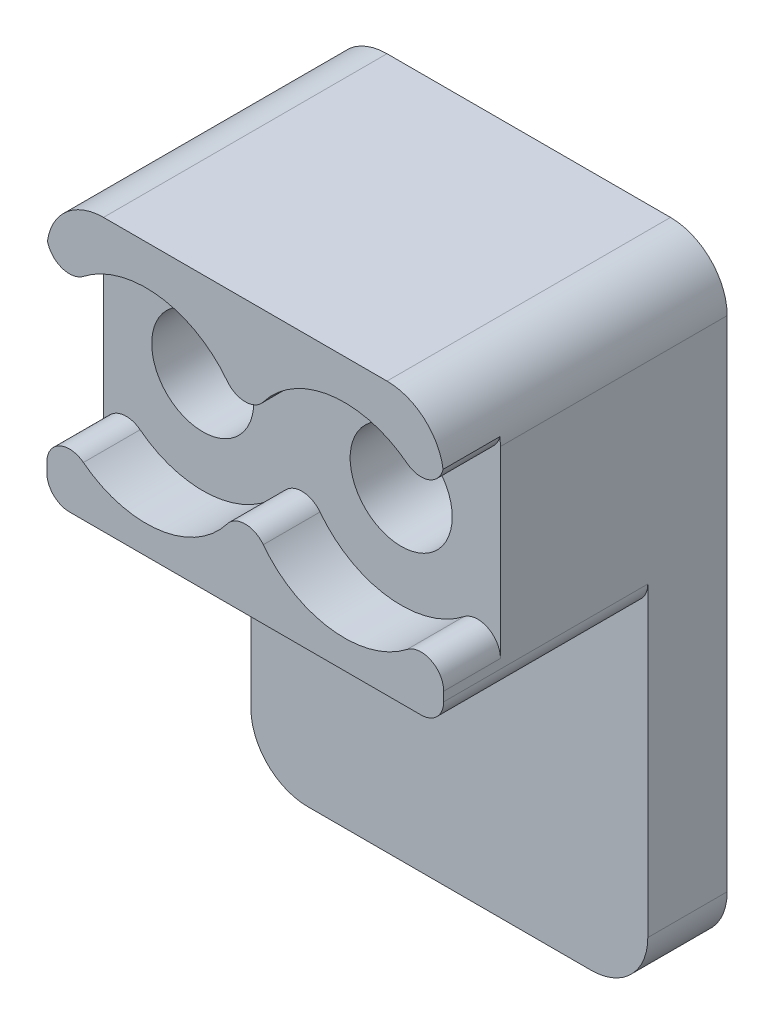
ISO-10303-21;
HEADER;
FILE_DESCRIPTION(('STEP AP214'),'2;1');
FILE_NAME('part.step','',(''),(''),'','','');
FILE_SCHEMA(('AUTOMOTIVE_DESIGN { 1 0 10303 214 1 1 1 1 }'));
ENDSEC;
DATA;
#1=APPLICATION_CONTEXT('core data for automotive mechanical design processes');
#2=APPLICATION_PROTOCOL_DEFINITION('international standard','automotive_design',2000,#1);
#3=PRODUCT_CONTEXT('',#1,'mechanical');
#4=PRODUCT('Part','Part','',(#3));
#5=PRODUCT_RELATED_PRODUCT_CATEGORY('part','',(#4));
#6=PRODUCT_DEFINITION_FORMATION('','',#4);
#7=PRODUCT_DEFINITION_CONTEXT('part definition',#1,'design');
#8=PRODUCT_DEFINITION('design','',#6,#7);
#9=PRODUCT_DEFINITION_SHAPE('','',#8);
#10=(LENGTH_UNIT() NAMED_UNIT(*) SI_UNIT(.MILLI.,.METRE.));
#11=(NAMED_UNIT(*) PLANE_ANGLE_UNIT() SI_UNIT($,.RADIAN.));
#12=(NAMED_UNIT(*) SI_UNIT($,.STERADIAN.) SOLID_ANGLE_UNIT());
#13=UNCERTAINTY_MEASURE_WITH_UNIT(LENGTH_MEASURE(1.E-05),#10,'distance_accuracy_value','');
#14=(GEOMETRIC_REPRESENTATION_CONTEXT(3) GLOBAL_UNCERTAINTY_ASSIGNED_CONTEXT((#13)) GLOBAL_UNIT_ASSIGNED_CONTEXT((#10,
#11,#12)) REPRESENTATION_CONTEXT('',''));
#15=CARTESIAN_POINT('',(0.,0.,0.));
#16=DIRECTION('',(0.,0.,1.));
#17=DIRECTION('',(1.,0.,0.));
#18=AXIS2_PLACEMENT_3D('',#15,#16,#17);
#19=CARTESIAN_POINT('',(17.78,27.432,12.7));
#20=DIRECTION('',(0.,0.,-1.));
#21=DIRECTION('',(0.,1.,0.));
#22=AXIS2_PLACEMENT_3D('',#19,#20,#21);
#23=PLANE('',#22);
#24=DIRECTION('',(-1.,0.,0.));
#25=VECTOR('',#24,1.);
#26=CARTESIAN_POINT('',(17.78,27.432,12.7));
#27=LINE('',#26,#25);
#28=CARTESIAN_POINT('',(15.24,27.432,12.7));
#29=VERTEX_POINT('',#28);
#30=CARTESIAN_POINT('',(2.54,27.432,12.7));
#31=VERTEX_POINT('',#30);
#32=EDGE_CURVE('E283',#29,#31,#27,.T.);
#33=ORIENTED_EDGE('',*,*,#32,.T.);
#34=CARTESIAN_POINT('',(2.54,24.892,12.7));
#35=DIRECTION('',(0.,0.,-1.));
#36=DIRECTION('',(0.,1.,0.));
#37=AXIS2_PLACEMENT_3D('',#34,#35,#36);
#38=CIRCLE('',#37,2.54);
#39=CARTESIAN_POINT('',(0.0270169226670651,25.2614807884563,12.7));
#40=VERTEX_POINT('',#39);
#41=EDGE_CURVE('E398',#31,#40,#38,.F.);
#42=ORIENTED_EDGE('',*,*,#41,.T.);
#43=CARTESIAN_POINT('',(1.016,25.4942220025742,12.7));
#44=DIRECTION('',(0.,0.,-1.));
#45=DIRECTION('',(0.,1.,0.));
#46=AXIS2_PLACEMENT_3D('',#43,#44,#45);
#47=CIRCLE('',#46,1.016);
#48=CARTESIAN_POINT('',(1.63945454545455,24.691999820288,12.7));
#49=VERTEX_POINT('',#48);
#50=EDGE_CURVE('E326',#40,#49,#47,.F.);
#51=ORIENTED_EDGE('',*,*,#50,.T.);
#52=CARTESIAN_POINT('',(4.445,21.082,12.7));
#53=DIRECTION('',(0.,0.,1.));
#54=DIRECTION('',(1.,0.,0.));
#55=AXIS2_PLACEMENT_3D('',#52,#53,#54);
#56=CIRCLE('',#55,4.572);
#57=CARTESIAN_POINT('',(8.08181818181818,23.8526926051796,12.7));
#58=VERTEX_POINT('',#57);
#59=EDGE_CURVE('E239',#58,#49,#56,.T.);
#60=ORIENTED_EDGE('',*,*,#59,.F.);
#61=CARTESIAN_POINT('',(8.89,24.4684020729972,12.7));
#62=DIRECTION('',(0.,0.,-1.));
#63=DIRECTION('',(0.,1.,0.));
#64=AXIS2_PLACEMENT_3D('',#61,#62,#63);
#65=CIRCLE('',#64,1.016);
#66=CARTESIAN_POINT('',(9.69818181818182,23.8526926051796,12.7));
#67=VERTEX_POINT('',#66);
#68=EDGE_CURVE('E329',#58,#67,#65,.F.);
#69=ORIENTED_EDGE('',*,*,#68,.T.);
#70=CARTESIAN_POINT('',(13.335,21.082,12.7));
#71=DIRECTION('',(0.,0.,1.));
#72=DIRECTION('',(1.,0.,0.));
#73=AXIS2_PLACEMENT_3D('',#70,#71,#72);
#74=CIRCLE('',#73,4.572);
#75=CARTESIAN_POINT('',(16.1405454545455,24.691999820288,12.7));
#76=VERTEX_POINT('',#75);
#77=EDGE_CURVE('E233',#76,#67,#74,.T.);
#78=ORIENTED_EDGE('',*,*,#77,.F.);
#79=CARTESIAN_POINT('',(16.764,25.4942220025742,12.7));
#80=DIRECTION('',(0.,0.,-1.));
#81=DIRECTION('',(0.,1.,0.));
#82=AXIS2_PLACEMENT_3D('',#79,#80,#81);
#83=CIRCLE('',#82,1.016);
#84=CARTESIAN_POINT('',(17.7529830773329,25.2614807884563,12.7));
#85=VERTEX_POINT('',#84);
#86=EDGE_CURVE('E322',#76,#85,#83,.F.);
#87=ORIENTED_EDGE('',*,*,#86,.T.);
#88=CARTESIAN_POINT('',(15.24,24.892,12.7));
#89=DIRECTION('',(0.,0.,-1.));
#90=DIRECTION('',(0.,1.,0.));
#91=AXIS2_PLACEMENT_3D('',#88,#89,#90);
#92=CIRCLE('',#91,2.54);
#93=EDGE_CURVE('E395',#85,#29,#92,.F.);
#94=ORIENTED_EDGE('',*,*,#93,.T.);
#95=EDGE_LOOP('',(#33,#42,#51,#60,#69,#78,#87,#94));
#96=FACE_BOUND('',#95,.T.);
#97=ADVANCED_FACE('F42',(#96),#23,.F.);
#98=CARTESIAN_POINT('',(13.335,21.082,0.));
#99=DIRECTION('',(0.,0.,1.));
#100=DIRECTION('',(1.,0.,0.));
#101=AXIS2_PLACEMENT_3D('',#98,#99,#100);
#102=CYLINDRICAL_SURFACE('',#101,2.286);
#103=CARTESIAN_POINT('',(13.335,21.082,0.));
#104=DIRECTION('',(0.,0.,1.));
#105=DIRECTION('',(-1.,0.,0.));
#106=AXIS2_PLACEMENT_3D('',#103,#104,#105);
#107=CIRCLE('',#106,2.286);
#108=CARTESIAN_POINT('',(11.049,21.082,0.));
#109=VERTEX_POINT('',#108);
#110=EDGE_CURVE('E248',#109,#109,#107,.T.);
#111=ORIENTED_EDGE('',*,*,#110,.F.);
#112=EDGE_LOOP('',(#111));
#113=FACE_BOUND('',#112,.T.);
#114=CARTESIAN_POINT('',(13.335,21.082,10.16));
#115=DIRECTION('',(0.,0.,1.));
#116=DIRECTION('',(1.,0.,0.));
#117=AXIS2_PLACEMENT_3D('',#114,#115,#116);
#118=CIRCLE('',#117,2.286);
#119=CARTESIAN_POINT('',(15.621,21.082,10.16));
#120=VERTEX_POINT('',#119);
#121=EDGE_CURVE('E252',#120,#120,#118,.F.);
#122=ORIENTED_EDGE('',*,*,#121,.F.);
#123=EDGE_LOOP('',(#122));
#124=FACE_BOUND('',#123,.T.);
#125=ADVANCED_FACE('F513',(#113,#124),#102,.F.);
#126=CARTESIAN_POINT('',(4.445,21.082,0.));
#127=DIRECTION('',(0.,0.,1.));
#128=DIRECTION('',(1.,0.,0.));
#129=AXIS2_PLACEMENT_3D('',#126,#127,#128);
#130=CYLINDRICAL_SURFACE('',#129,2.286);
#131=CARTESIAN_POINT('',(4.445,21.082,0.));
#132=DIRECTION('',(0.,0.,1.));
#133=DIRECTION('',(1.,0.,0.));
#134=AXIS2_PLACEMENT_3D('',#131,#132,#133);
#135=CIRCLE('',#134,2.286);
#136=CARTESIAN_POINT('',(6.731,21.082,0.));
#137=VERTEX_POINT('',#136);
#138=EDGE_CURVE('E243',#137,#137,#135,.T.);
#139=ORIENTED_EDGE('',*,*,#138,.F.);
#140=EDGE_LOOP('',(#139));
#141=FACE_BOUND('',#140,.T.);
#142=CARTESIAN_POINT('',(4.445,21.082,10.16));
#143=DIRECTION('',(0.,0.,1.));
#144=DIRECTION('',(1.,0.,0.));
#145=AXIS2_PLACEMENT_3D('',#142,#143,#144);
#146=CIRCLE('',#145,2.286);
#147=CARTESIAN_POINT('',(6.731,21.082,10.16));
#148=VERTEX_POINT('',#147);
#149=EDGE_CURVE('E505',#148,#148,#146,.F.);
#150=ORIENTED_EDGE('',*,*,#149,.F.);
#151=EDGE_LOOP('',(#150));
#152=FACE_BOUND('',#151,.T.);
#153=ADVANCED_FACE('F515',(#141,#152),#130,.F.);
#154=CARTESIAN_POINT('',(17.78,15.24,3.556));
#155=DIRECTION('',(0.,0.,-1.));
#156=DIRECTION('',(0.,1.,0.));
#157=AXIS2_PLACEMENT_3D('',#154,#155,#156);
#158=PLANE('',#157);
#159=DIRECTION('',(0.,-1.,0.));
#160=VECTOR('',#159,1.);
#161=CARTESIAN_POINT('',(0.,15.24,3.556));
#162=LINE('',#161,#160);
#163=CARTESIAN_POINT('',(0.,16.256,3.556));
#164=VERTEX_POINT('',#163);
#165=CARTESIAN_POINT('',(0.,2.54,3.556));
#166=VERTEX_POINT('',#165);
#167=EDGE_CURVE('E247',#164,#166,#162,.T.);
#168=ORIENTED_EDGE('',*,*,#167,.T.);
#169=CARTESIAN_POINT('',(2.54,2.54,3.556));
#170=DIRECTION('',(0.,0.,-1.));
#171=DIRECTION('',(0.,1.,0.));
#172=AXIS2_PLACEMENT_3D('',#169,#170,#171);
#173=CIRCLE('',#172,2.54);
#174=CARTESIAN_POINT('',(2.54,0.,3.556));
#175=VERTEX_POINT('',#174);
#176=EDGE_CURVE('E11',#166,#175,#173,.F.);
#177=ORIENTED_EDGE('',*,*,#176,.T.);
#178=DIRECTION('',(-1.,0.,0.));
#179=VECTOR('',#178,1.);
#180=CARTESIAN_POINT('',(17.78,0.,3.556));
#181=LINE('',#180,#179);
#182=CARTESIAN_POINT('',(15.24,0.,3.556));
#183=VERTEX_POINT('',#182);
#184=EDGE_CURVE('E295',#183,#175,#181,.T.);
#185=ORIENTED_EDGE('',*,*,#184,.F.);
#186=CARTESIAN_POINT('',(15.24,2.54,3.556));
#187=DIRECTION('',(0.,0.,-1.));
#188=DIRECTION('',(0.,1.,0.));
#189=AXIS2_PLACEMENT_3D('',#186,#187,#188);
#190=CIRCLE('',#189,2.54);
#191=CARTESIAN_POINT('',(17.78,2.54,3.556));
#192=VERTEX_POINT('',#191);
#193=EDGE_CURVE('E51',#183,#192,#190,.F.);
#194=ORIENTED_EDGE('',*,*,#193,.T.);
#195=DIRECTION('',(0.,-1.,0.));
#196=VECTOR('',#195,1.);
#197=CARTESIAN_POINT('',(17.78,15.24,3.556));
#198=LINE('',#197,#196);
#199=CARTESIAN_POINT('',(17.78,16.256,3.556));
#200=VERTEX_POINT('',#199);
#201=EDGE_CURVE('E253',#200,#192,#198,.T.);
#202=ORIENTED_EDGE('',*,*,#201,.F.);
#203=CARTESIAN_POINT('',(16.764,16.256,3.556));
#204=DIRECTION('',(0.,0.,-1.));
#205=DIRECTION('',(0.,1.,0.));
#206=AXIS2_PLACEMENT_3D('',#203,#204,#205);
#207=CIRCLE('',#206,1.016);
#208=CARTESIAN_POINT('',(16.764,15.24,3.556));
#209=VERTEX_POINT('',#208);
#210=EDGE_CURVE('E367',#200,#209,#207,.T.);
#211=ORIENTED_EDGE('',*,*,#210,.T.);
#212=DIRECTION('',(-1.,0.,0.));
#213=VECTOR('',#212,1.);
#214=CARTESIAN_POINT('',(17.78,15.24,3.556));
#215=LINE('',#214,#213);
#216=CARTESIAN_POINT('',(1.016,15.24,3.556));
#217=VERTEX_POINT('',#216);
#218=EDGE_CURVE('E266',#209,#217,#215,.T.);
#219=ORIENTED_EDGE('',*,*,#218,.T.);
#220=CARTESIAN_POINT('',(1.016,16.256,3.556));
#221=DIRECTION('',(0.,0.,-1.));
#222=DIRECTION('',(0.,1.,0.));
#223=AXIS2_PLACEMENT_3D('',#220,#221,#222);
#224=CIRCLE('',#223,1.016);
#225=EDGE_CURVE('E370',#217,#164,#224,.T.);
#226=ORIENTED_EDGE('',*,*,#225,.T.);
#227=EDGE_LOOP('',(#168,#177,#185,#194,#202,#211,#219,#226));
#228=FACE_BOUND('',#227,.T.);
#229=ADVANCED_FACE('F446',(#228),#158,.F.);
#230=CARTESIAN_POINT('',(17.78,0.,3.556));
#231=DIRECTION('',(0.,1.,0.));
#232=DIRECTION('',(0.,0.,1.));
#233=AXIS2_PLACEMENT_3D('',#230,#231,#232);
#234=PLANE('',#233);
#235=ORIENTED_EDGE('',*,*,#184,.T.);
#236=DIRECTION('',(0.,0.,-1.));
#237=VECTOR('',#236,1.);
#238=CARTESIAN_POINT('',(2.54,0.,3.556));
#239=LINE('',#238,#237);
#240=CARTESIAN_POINT('',(2.54,0.,0.));
#241=VERTEX_POINT('',#240);
#242=EDGE_CURVE('E441',#175,#241,#239,.T.);
#243=ORIENTED_EDGE('',*,*,#242,.T.);
#244=DIRECTION('',(-1.,0.,0.));
#245=VECTOR('',#244,1.);
#246=CARTESIAN_POINT('',(17.78,0.,0.));
#247=LINE('',#246,#245);
#248=CARTESIAN_POINT('',(15.24,0.,0.));
#249=VERTEX_POINT('',#248);
#250=EDGE_CURVE('E291',#249,#241,#247,.T.);
#251=ORIENTED_EDGE('',*,*,#250,.F.);
#252=DIRECTION('',(0.,0.,-1.));
#253=VECTOR('',#252,1.);
#254=CARTESIAN_POINT('',(15.24,0.,3.556));
#255=LINE('',#254,#253);
#256=EDGE_CURVE('E63',#249,#183,#255,.F.);
#257=ORIENTED_EDGE('',*,*,#256,.T.);
#258=EDGE_LOOP('',(#235,#243,#251,#257));
#259=FACE_BOUND('',#258,.T.);
#260=ADVANCED_FACE('F456',(#259),#234,.F.);
#261=CARTESIAN_POINT('',(17.78,0.,0.));
#262=DIRECTION('',(0.,0.,1.));
#263=DIRECTION('',(1.,0.,0.));
#264=AXIS2_PLACEMENT_3D('',#261,#262,#263);
#265=PLANE('',#264);
#266=ORIENTED_EDGE('',*,*,#138,.T.);
#267=EDGE_LOOP('',(#266));
#268=FACE_BOUND('',#267,.T.);
#269=ORIENTED_EDGE('',*,*,#110,.T.);
#270=EDGE_LOOP('',(#269));
#271=FACE_BOUND('',#270,.T.);
#272=DIRECTION('',(0.,1.,0.));
#273=VECTOR('',#272,1.);
#274=CARTESIAN_POINT('',(0.,0.,0.));
#275=LINE('',#274,#273);
#276=CARTESIAN_POINT('',(0.,2.54,0.));
#277=VERTEX_POINT('',#276);
#278=CARTESIAN_POINT('',(0.,24.892,0.));
#279=VERTEX_POINT('',#278);
#280=EDGE_CURVE('E269',#277,#279,#275,.T.);
#281=ORIENTED_EDGE('',*,*,#280,.T.);
#282=CARTESIAN_POINT('',(2.54,24.892,0.));
#283=DIRECTION('',(0.,0.,1.));
#284=DIRECTION('',(1.,0.,0.));
#285=AXIS2_PLACEMENT_3D('',#282,#283,#284);
#286=CIRCLE('',#285,2.54);
#287=CARTESIAN_POINT('',(2.54,27.432,0.));
#288=VERTEX_POINT('',#287);
#289=EDGE_CURVE('E425',#279,#288,#286,.F.);
#290=ORIENTED_EDGE('',*,*,#289,.T.);
#291=DIRECTION('',(-1.,0.,0.));
#292=VECTOR('',#291,1.);
#293=CARTESIAN_POINT('',(17.78,27.432,0.));
#294=LINE('',#293,#292);
#295=CARTESIAN_POINT('',(15.24,27.432,0.));
#296=VERTEX_POINT('',#295);
#297=EDGE_CURVE('E287',#296,#288,#294,.T.);
#298=ORIENTED_EDGE('',*,*,#297,.F.);
#299=CARTESIAN_POINT('',(15.24,24.892,0.));
#300=DIRECTION('',(0.,0.,1.));
#301=DIRECTION('',(1.,0.,0.));
#302=AXIS2_PLACEMENT_3D('',#299,#300,#301);
#303=CIRCLE('',#302,2.54);
#304=CARTESIAN_POINT('',(17.78,24.892,0.));
#305=VERTEX_POINT('',#304);
#306=EDGE_CURVE('E422',#296,#305,#303,.F.);
#307=ORIENTED_EDGE('',*,*,#306,.T.);
#308=DIRECTION('',(0.,1.,0.));
#309=VECTOR('',#308,1.);
#310=CARTESIAN_POINT('',(17.78,0.,0.));
#311=LINE('',#310,#309);
#312=CARTESIAN_POINT('',(17.78,2.54,0.));
#313=VERTEX_POINT('',#312);
#314=EDGE_CURVE('E257',#313,#305,#311,.T.);
#315=ORIENTED_EDGE('',*,*,#314,.F.);
#316=CARTESIAN_POINT('',(15.24,2.54,0.));
#317=DIRECTION('',(0.,0.,1.));
#318=DIRECTION('',(1.,0.,0.));
#319=AXIS2_PLACEMENT_3D('',#316,#317,#318);
#320=CIRCLE('',#319,2.54);
#321=EDGE_CURVE('E416',#313,#249,#320,.F.);
#322=ORIENTED_EDGE('',*,*,#321,.T.);
#323=ORIENTED_EDGE('',*,*,#250,.T.);
#324=CARTESIAN_POINT('',(2.54,2.54,0.));
#325=DIRECTION('',(0.,0.,1.));
#326=DIRECTION('',(1.,0.,0.));
#327=AXIS2_PLACEMENT_3D('',#324,#325,#326);
#328=CIRCLE('',#327,2.54);
#329=EDGE_CURVE('E419',#241,#277,#328,.F.);
#330=ORIENTED_EDGE('',*,*,#329,.T.);
#331=EDGE_LOOP('',(#281,#290,#298,#307,#315,#322,#323,#330));
#332=FACE_BOUND('',#331,.T.);
#333=ADVANCED_FACE('F455',(#268,#271,#332),#265,.F.);
#334=CARTESIAN_POINT('',(17.78,27.432,0.));
#335=DIRECTION('',(0.,-1.,0.));
#336=DIRECTION('',(0.,0.,-1.));
#337=AXIS2_PLACEMENT_3D('',#334,#335,#336);
#338=PLANE('',#337);
#339=ORIENTED_EDGE('',*,*,#297,.T.);
#340=DIRECTION('',(0.,0.,1.));
#341=VECTOR('',#340,1.);
#342=CARTESIAN_POINT('',(2.54,27.432,0.));
#343=LINE('',#342,#341);
#344=EDGE_CURVE('E391',#288,#31,#343,.T.);
#345=ORIENTED_EDGE('',*,*,#344,.T.);
#346=ORIENTED_EDGE('',*,*,#32,.F.);
#347=DIRECTION('',(0.,0.,1.));
#348=VECTOR('',#347,1.);
#349=CARTESIAN_POINT('',(15.24,27.432,0.));
#350=LINE('',#349,#348);
#351=EDGE_CURVE('E388',#29,#296,#350,.F.);
#352=ORIENTED_EDGE('',*,*,#351,.T.);
#353=EDGE_LOOP('',(#339,#345,#346,#352));
#354=FACE_BOUND('',#353,.T.);
#355=ADVANCED_FACE('F476',(#354),#338,.F.);
#356=CARTESIAN_POINT('',(9.69818181818182,18.3113073948204,12.7));
#357=VERTEX_POINT('',#356);
#358=CARTESIAN_POINT('',(16.1405454545455,17.472000179712,12.7));
#359=VERTEX_POINT('',#358);
#360=EDGE_CURVE('E222',#357,#359,#74,.T.);
#361=ORIENTED_EDGE('',*,*,#360,.F.);
#362=CARTESIAN_POINT('',(8.89,17.6955979270028,12.7));
#363=DIRECTION('',(0.,0.,-1.));
#364=DIRECTION('',(0.,1.,0.));
#365=AXIS2_PLACEMENT_3D('',#362,#363,#364);
#366=CIRCLE('',#365,1.016);
#367=CARTESIAN_POINT('',(8.08181818181818,18.3113073948204,12.7));
#368=VERTEX_POINT('',#367);
#369=EDGE_CURVE('E204',#357,#368,#366,.F.);
#370=ORIENTED_EDGE('',*,*,#369,.T.);
#371=CARTESIAN_POINT('',(1.63945454545455,17.472000179712,12.7));
#372=VERTEX_POINT('',#371);
#373=EDGE_CURVE('E234',#372,#368,#56,.T.);
#374=ORIENTED_EDGE('',*,*,#373,.F.);
#375=CARTESIAN_POINT('',(1.016,16.6697779974258,12.7));
#376=DIRECTION('',(0.,0.,-1.));
#377=DIRECTION('',(0.,1.,0.));
#378=AXIS2_PLACEMENT_3D('',#375,#376,#377);
#379=CIRCLE('',#378,1.016);
#380=CARTESIAN_POINT('',(0.,16.6697779974258,12.7));
#381=VERTEX_POINT('',#380);
#382=EDGE_CURVE('E302',#372,#381,#379,.F.);
#383=ORIENTED_EDGE('',*,*,#382,.T.);
#384=DIRECTION('',(0.,-1.,0.));
#385=VECTOR('',#384,1.);
#386=CARTESIAN_POINT('',(0.,27.432,12.7));
#387=LINE('',#386,#385);
#388=CARTESIAN_POINT('',(0.,16.256,12.7));
#389=VERTEX_POINT('',#388);
#390=EDGE_CURVE('E258',#381,#389,#387,.T.);
#391=ORIENTED_EDGE('',*,*,#390,.T.);
#392=CARTESIAN_POINT('',(1.016,16.256,12.7));
#393=DIRECTION('',(0.,0.,-1.));
#394=DIRECTION('',(0.,1.,0.));
#395=AXIS2_PLACEMENT_3D('',#392,#393,#394);
#396=CIRCLE('',#395,1.016);
#397=CARTESIAN_POINT('',(1.016,15.24,12.7));
#398=VERTEX_POINT('',#397);
#399=EDGE_CURVE('E305',#389,#398,#396,.F.);
#400=ORIENTED_EDGE('',*,*,#399,.T.);
#401=DIRECTION('',(-1.,0.,0.));
#402=VECTOR('',#401,1.);
#403=CARTESIAN_POINT('',(17.78,15.24,12.7));
#404=LINE('',#403,#402);
#405=CARTESIAN_POINT('',(16.764,15.24,12.7));
#406=VERTEX_POINT('',#405);
#407=EDGE_CURVE('E279',#406,#398,#404,.T.);
#408=ORIENTED_EDGE('',*,*,#407,.F.);
#409=CARTESIAN_POINT('',(16.764,16.256,12.7));
#410=DIRECTION('',(0.,0.,-1.));
#411=DIRECTION('',(0.,1.,0.));
#412=AXIS2_PLACEMENT_3D('',#409,#410,#411);
#413=CIRCLE('',#412,1.016);
#414=CARTESIAN_POINT('',(17.78,16.256,12.7));
#415=VERTEX_POINT('',#414);
#416=EDGE_CURVE('E216',#406,#415,#413,.F.);
#417=ORIENTED_EDGE('',*,*,#416,.T.);
#418=DIRECTION('',(0.,-1.,0.));
#419=VECTOR('',#418,1.);
#420=CARTESIAN_POINT('',(17.78,27.432,12.7));
#421=LINE('',#420,#419);
#422=CARTESIAN_POINT('',(17.78,16.6697779974258,12.7));
#423=VERTEX_POINT('',#422);
#424=EDGE_CURVE('E262',#423,#415,#421,.T.);
#425=ORIENTED_EDGE('',*,*,#424,.F.);
#426=CARTESIAN_POINT('',(16.764,16.6697779974258,12.7));
#427=DIRECTION('',(0.,0.,-1.));
#428=DIRECTION('',(0.,1.,0.));
#429=AXIS2_PLACEMENT_3D('',#426,#427,#428);
#430=CIRCLE('',#429,1.016);
#431=EDGE_CURVE('E227',#423,#359,#430,.F.);
#432=ORIENTED_EDGE('',*,*,#431,.T.);
#433=EDGE_LOOP('',(#361,#370,#374,#383,#391,#400,#408,#417,#425,#432));
#434=FACE_BOUND('',#433,.T.);
#435=ADVANCED_FACE('F230',(#434),#23,.F.);
#436=CARTESIAN_POINT('',(17.78,15.24,12.7));
#437=DIRECTION('',(0.,1.,0.));
#438=DIRECTION('',(0.,0.,1.));
#439=AXIS2_PLACEMENT_3D('',#436,#437,#438);
#440=PLANE('',#439);
#441=ORIENTED_EDGE('',*,*,#218,.F.);
#442=DIRECTION('',(0.,0.,-1.));
#443=VECTOR('',#442,1.);
#444=CARTESIAN_POINT('',(16.764,15.24,12.7));
#445=LINE('',#444,#443);
#446=EDGE_CURVE('E351',#209,#406,#445,.F.);
#447=ORIENTED_EDGE('',*,*,#446,.T.);
#448=ORIENTED_EDGE('',*,*,#407,.T.);
#449=DIRECTION('',(0.,0.,-1.));
#450=VECTOR('',#449,1.);
#451=CARTESIAN_POINT('',(1.016,15.24,12.7));
#452=LINE('',#451,#450);
#453=EDGE_CURVE('E347',#398,#217,#452,.T.);
#454=ORIENTED_EDGE('',*,*,#453,.T.);
#455=EDGE_LOOP('',(#441,#447,#448,#454));
#456=FACE_BOUND('',#455,.T.);
#457=ADVANCED_FACE('F531',(#456),#440,.F.);
#458=CARTESIAN_POINT('',(17.78,0.,0.));
#459=DIRECTION('',(1.,0.,0.));
#460=DIRECTION('',(0.,0.,-1.));
#461=AXIS2_PLACEMENT_3D('',#458,#459,#460);
#462=PLANE('',#461);
#463=ORIENTED_EDGE('',*,*,#314,.T.);
#464=DIRECTION('',(0.,0.,1.));
#465=VECTOR('',#464,1.);
#466=CARTESIAN_POINT('',(17.78,24.892,12.7));
#467=LINE('',#466,#465);
#468=CARTESIAN_POINT('',(17.78,24.892,10.16));
#469=VERTEX_POINT('',#468);
#470=EDGE_CURVE('E432',#305,#469,#467,.T.);
#471=ORIENTED_EDGE('',*,*,#470,.T.);
#472=DIRECTION('',(0.,1.,0.));
#473=VECTOR('',#472,1.);
#474=CARTESIAN_POINT('',(17.78,0.,10.16));
#475=LINE('',#474,#473);
#476=CARTESIAN_POINT('',(17.78,16.6697779974258,10.16));
#477=VERTEX_POINT('',#476);
#478=EDGE_CURVE('E485',#477,#469,#475,.T.);
#479=ORIENTED_EDGE('',*,*,#478,.F.);
#480=DIRECTION('',(0.,0.,-1.));
#481=VECTOR('',#480,1.);
#482=CARTESIAN_POINT('',(17.78,16.6697779974258,12.7));
#483=LINE('',#482,#481);
#484=EDGE_CURVE('E339',#477,#423,#483,.F.);
#485=ORIENTED_EDGE('',*,*,#484,.T.);
#486=ORIENTED_EDGE('',*,*,#424,.T.);
#487=DIRECTION('',(0.,0.,-1.));
#488=VECTOR('',#487,1.);
#489=CARTESIAN_POINT('',(17.78,16.256,3.556));
#490=LINE('',#489,#488);
#491=EDGE_CURVE('E343',#415,#200,#490,.T.);
#492=ORIENTED_EDGE('',*,*,#491,.T.);
#493=ORIENTED_EDGE('',*,*,#201,.T.);
#494=DIRECTION('',(0.,0.,-1.));
#495=VECTOR('',#494,1.);
#496=CARTESIAN_POINT('',(17.78,2.54,0.));
#497=LINE('',#496,#495);
#498=EDGE_CURVE('E428',#192,#313,#497,.T.);
#499=ORIENTED_EDGE('',*,*,#498,.T.);
#500=EDGE_LOOP('',(#463,#471,#479,#485,#486,#492,#493,#499));
#501=FACE_BOUND('',#500,.T.);
#502=ADVANCED_FACE('F451',(#501),#462,.T.);
#503=CARTESIAN_POINT('',(0.,0.,0.));
#504=DIRECTION('',(1.,0.,0.));
#505=DIRECTION('',(0.,0.,-1.));
#506=AXIS2_PLACEMENT_3D('',#503,#504,#505);
#507=PLANE('',#506);
#508=DIRECTION('',(0.,-1.,0.));
#509=VECTOR('',#508,1.);
#510=CARTESIAN_POINT('',(0.,0.,10.16));
#511=LINE('',#510,#509);
#512=CARTESIAN_POINT('',(0.,24.892,10.16));
#513=VERTEX_POINT('',#512);
#514=CARTESIAN_POINT('',(0.,16.6697779974258,10.16));
#515=VERTEX_POINT('',#514);
#516=EDGE_CURVE('E467',#513,#515,#511,.T.);
#517=ORIENTED_EDGE('',*,*,#516,.F.);
#518=DIRECTION('',(0.,0.,1.));
#519=VECTOR('',#518,1.);
#520=CARTESIAN_POINT('',(0.,24.892,0.));
#521=LINE('',#520,#519);
#522=EDGE_CURVE('E413',#513,#279,#521,.F.);
#523=ORIENTED_EDGE('',*,*,#522,.T.);
#524=ORIENTED_EDGE('',*,*,#280,.F.);
#525=DIRECTION('',(0.,0.,-1.));
#526=VECTOR('',#525,1.);
#527=CARTESIAN_POINT('',(0.,2.54,0.));
#528=LINE('',#527,#526);
#529=EDGE_CURVE('E410',#277,#166,#528,.F.);
#530=ORIENTED_EDGE('',*,*,#529,.T.);
#531=ORIENTED_EDGE('',*,*,#167,.F.);
#532=DIRECTION('',(0.,0.,-1.));
#533=VECTOR('',#532,1.);
#534=CARTESIAN_POINT('',(0.,16.256,0.));
#535=LINE('',#534,#533);
#536=EDGE_CURVE('E358',#164,#389,#535,.F.);
#537=ORIENTED_EDGE('',*,*,#536,.T.);
#538=ORIENTED_EDGE('',*,*,#390,.F.);
#539=DIRECTION('',(0.,0.,1.));
#540=VECTOR('',#539,1.);
#541=CARTESIAN_POINT('',(0.,16.6697779974258,0.));
#542=LINE('',#541,#540);
#543=EDGE_CURVE('E354',#381,#515,#542,.F.);
#544=ORIENTED_EDGE('',*,*,#543,.T.);
#545=EDGE_LOOP('',(#517,#523,#524,#530,#531,#537,#538,#544));
#546=FACE_BOUND('',#545,.T.);
#547=ADVANCED_FACE('F465',(#546),#507,.F.);
#548=CARTESIAN_POINT('',(4.445,21.082,10.16));
#549=DIRECTION('',(0.,0.,1.));
#550=DIRECTION('',(1.,0.,0.));
#551=AXIS2_PLACEMENT_3D('',#548,#549,#550);
#552=CYLINDRICAL_SURFACE('',#551,4.572);
#553=ORIENTED_EDGE('',*,*,#373,.T.);
#554=DIRECTION('',(0.,0.,1.));
#555=VECTOR('',#554,1.);
#556=CARTESIAN_POINT('',(8.08181818181818,18.3113073948204,10.16));
#557=LINE('',#556,#555);
#558=CARTESIAN_POINT('',(8.08181818181818,18.3113073948204,10.16));
#559=VERTEX_POINT('',#558);
#560=EDGE_CURVE('E209',#368,#559,#557,.F.);
#561=ORIENTED_EDGE('',*,*,#560,.T.);
#562=CARTESIAN_POINT('',(4.445,21.082,10.16));
#563=DIRECTION('',(0.,0.,1.));
#564=DIRECTION('',(1.,0.,0.));
#565=AXIS2_PLACEMENT_3D('',#562,#563,#564);
#566=CIRCLE('',#565,4.572);
#567=CARTESIAN_POINT('',(1.63945454545455,17.472000179712,10.16));
#568=VERTEX_POINT('',#567);
#569=EDGE_CURVE('E500',#568,#559,#566,.T.);
#570=ORIENTED_EDGE('',*,*,#569,.F.);
#571=DIRECTION('',(0.,0.,1.));
#572=VECTOR('',#571,1.);
#573=CARTESIAN_POINT('',(1.63945454545455,17.472000179712,10.16));
#574=LINE('',#573,#572);
#575=EDGE_CURVE('E215',#568,#372,#574,.T.);
#576=ORIENTED_EDGE('',*,*,#575,.T.);
#577=EDGE_LOOP('',(#553,#561,#570,#576));
#578=FACE_BOUND('',#577,.T.);
#579=ADVANCED_FACE('F534',(#578),#552,.F.);
#580=CARTESIAN_POINT('',(8.08181818181818,23.8526926051796,10.16));
#581=VERTEX_POINT('',#580);
#582=CARTESIAN_POINT('',(1.63945454545455,24.691999820288,10.16));
#583=VERTEX_POINT('',#582);
#584=EDGE_CURVE('E498',#581,#583,#566,.T.);
#585=ORIENTED_EDGE('',*,*,#584,.F.);
#586=DIRECTION('',(0.,0.,1.));
#587=VECTOR('',#586,1.);
#588=CARTESIAN_POINT('',(8.08181818181818,23.8526926051796,10.16));
#589=LINE('',#588,#587);
#590=EDGE_CURVE('E318',#581,#58,#589,.T.);
#591=ORIENTED_EDGE('',*,*,#590,.T.);
#592=ORIENTED_EDGE('',*,*,#59,.T.);
#593=DIRECTION('',(0.,0.,1.));
#594=VECTOR('',#593,1.);
#595=CARTESIAN_POINT('',(1.63945454545455,24.691999820288,10.16));
#596=LINE('',#595,#594);
#597=EDGE_CURVE('E315',#49,#583,#596,.F.);
#598=ORIENTED_EDGE('',*,*,#597,.T.);
#599=EDGE_LOOP('',(#585,#591,#592,#598));
#600=FACE_BOUND('',#599,.T.);
#601=ADVANCED_FACE('F744',(#600),#552,.F.);
#602=CARTESIAN_POINT('',(13.335,21.082,10.16));
#603=DIRECTION('',(0.,0.,1.));
#604=DIRECTION('',(1.,0.,0.));
#605=AXIS2_PLACEMENT_3D('',#602,#603,#604);
#606=CYLINDRICAL_SURFACE('',#605,4.572);
#607=ORIENTED_EDGE('',*,*,#77,.T.);
#608=DIRECTION('',(0.,0.,1.));
#609=VECTOR('',#608,1.);
#610=CARTESIAN_POINT('',(9.69818181818182,23.8526926051796,10.16));
#611=LINE('',#610,#609);
#612=CARTESIAN_POINT('',(9.69818181818182,23.8526926051796,10.16));
#613=VERTEX_POINT('',#612);
#614=EDGE_CURVE('E336',#67,#613,#611,.F.);
#615=ORIENTED_EDGE('',*,*,#614,.T.);
#616=CARTESIAN_POINT('',(13.335,21.082,10.16));
#617=DIRECTION('',(0.,0.,1.));
#618=DIRECTION('',(1.,0.,0.));
#619=AXIS2_PLACEMENT_3D('',#616,#617,#618);
#620=CIRCLE('',#619,4.572);
#621=CARTESIAN_POINT('',(16.1405454545455,24.691999820288,10.16));
#622=VERTEX_POINT('',#621);
#623=EDGE_CURVE('E493',#622,#613,#620,.T.);
#624=ORIENTED_EDGE('',*,*,#623,.F.);
#625=DIRECTION('',(0.,0.,1.));
#626=VECTOR('',#625,1.);
#627=CARTESIAN_POINT('',(16.1405454545455,24.691999820288,10.16));
#628=LINE('',#627,#626);
#629=EDGE_CURVE('E332',#622,#76,#628,.T.);
#630=ORIENTED_EDGE('',*,*,#629,.T.);
#631=EDGE_LOOP('',(#607,#615,#624,#630));
#632=FACE_BOUND('',#631,.T.);
#633=ADVANCED_FACE('F735',(#632),#606,.F.);
#634=CARTESIAN_POINT('',(9.69818181818182,18.3113073948204,10.16));
#635=VERTEX_POINT('',#634);
#636=CARTESIAN_POINT('',(16.1405454545455,17.472000179712,10.16));
#637=VERTEX_POINT('',#636);
#638=EDGE_CURVE('E225',#635,#637,#620,.T.);
#639=ORIENTED_EDGE('',*,*,#638,.F.);
#640=DIRECTION('',(0.,0.,1.));
#641=VECTOR('',#640,1.);
#642=CARTESIAN_POINT('',(9.69818181818182,18.3113073948204,10.16));
#643=LINE('',#642,#641);
#644=EDGE_CURVE('E208',#635,#357,#643,.T.);
#645=ORIENTED_EDGE('',*,*,#644,.T.);
#646=ORIENTED_EDGE('',*,*,#360,.T.);
#647=DIRECTION('',(0.,0.,1.));
#648=VECTOR('',#647,1.);
#649=CARTESIAN_POINT('',(16.1405454545455,17.472000179712,10.16));
#650=LINE('',#649,#648);
#651=EDGE_CURVE('E228',#359,#637,#650,.F.);
#652=ORIENTED_EDGE('',*,*,#651,.T.);
#653=EDGE_LOOP('',(#639,#645,#646,#652));
#654=FACE_BOUND('',#653,.T.);
#655=ADVANCED_FACE('F221',(#654),#606,.F.);
#656=CARTESIAN_POINT('',(0.,0.,10.16));
#657=DIRECTION('',(0.,0.,1.));
#658=DIRECTION('',(1.,0.,0.));
#659=AXIS2_PLACEMENT_3D('',#656,#657,#658);
#660=PLANE('',#659);
#661=CARTESIAN_POINT('',(1.016,25.4942220025742,10.16));
#662=DIRECTION('',(0.,0.,1.));
#663=DIRECTION('',(1.,0.,0.));
#664=AXIS2_PLACEMENT_3D('',#661,#662,#663);
#665=CIRCLE('',#664,1.016);
#666=CARTESIAN_POINT('',(0.0270169226670651,25.2614807884563,10.16));
#667=VERTEX_POINT('',#666);
#668=EDGE_CURVE('E374',#583,#667,#665,.F.);
#669=ORIENTED_EDGE('',*,*,#668,.T.);
#670=CARTESIAN_POINT('',(2.54,24.892,10.16));
#671=DIRECTION('',(0.,0.,1.));
#672=DIRECTION('',(1.,0.,0.));
#673=AXIS2_PLACEMENT_3D('',#670,#671,#672);
#674=CIRCLE('',#673,2.54);
#675=EDGE_CURVE('E407',#667,#513,#674,.T.);
#676=ORIENTED_EDGE('',*,*,#675,.T.);
#677=ORIENTED_EDGE('',*,*,#516,.T.);
#678=CARTESIAN_POINT('',(1.016,16.6697779974258,10.16));
#679=DIRECTION('',(0.,0.,1.));
#680=DIRECTION('',(1.,0.,0.));
#681=AXIS2_PLACEMENT_3D('',#678,#679,#680);
#682=CIRCLE('',#681,1.016);
#683=EDGE_CURVE('E378',#515,#568,#682,.F.);
#684=ORIENTED_EDGE('',*,*,#683,.T.);
#685=ORIENTED_EDGE('',*,*,#569,.T.);
#686=CARTESIAN_POINT('',(8.89,17.6955979270028,10.16));
#687=DIRECTION('',(0.,0.,1.));
#688=DIRECTION('',(1.,0.,0.));
#689=AXIS2_PLACEMENT_3D('',#686,#687,#688);
#690=CIRCLE('',#689,1.016);
#691=EDGE_CURVE('E361',#559,#635,#690,.F.);
#692=ORIENTED_EDGE('',*,*,#691,.T.);
#693=ORIENTED_EDGE('',*,*,#638,.T.);
#694=CARTESIAN_POINT('',(16.764,16.6697779974258,10.16));
#695=DIRECTION('',(0.,0.,1.));
#696=DIRECTION('',(1.,0.,0.));
#697=AXIS2_PLACEMENT_3D('',#694,#695,#696);
#698=CIRCLE('',#697,1.016);
#699=EDGE_CURVE('E381',#637,#477,#698,.F.);
#700=ORIENTED_EDGE('',*,*,#699,.T.);
#701=ORIENTED_EDGE('',*,*,#478,.T.);
#702=CARTESIAN_POINT('',(15.24,24.892,10.16));
#703=DIRECTION('',(0.,0.,1.));
#704=DIRECTION('',(1.,0.,0.));
#705=AXIS2_PLACEMENT_3D('',#702,#703,#704);
#706=CIRCLE('',#705,2.54);
#707=CARTESIAN_POINT('',(17.7529830773329,25.2614807884563,10.16));
#708=VERTEX_POINT('',#707);
#709=EDGE_CURVE('E404',#469,#708,#706,.T.);
#710=ORIENTED_EDGE('',*,*,#709,.T.);
#711=CARTESIAN_POINT('',(16.764,25.4942220025742,10.16));
#712=DIRECTION('',(0.,0.,1.));
#713=DIRECTION('',(1.,0.,0.));
#714=AXIS2_PLACEMENT_3D('',#711,#712,#713);
#715=CIRCLE('',#714,1.016);
#716=EDGE_CURVE('E385',#708,#622,#715,.F.);
#717=ORIENTED_EDGE('',*,*,#716,.T.);
#718=ORIENTED_EDGE('',*,*,#623,.T.);
#719=CARTESIAN_POINT('',(8.89,24.4684020729972,10.16));
#720=DIRECTION('',(0.,0.,1.));
#721=DIRECTION('',(1.,0.,0.));
#722=AXIS2_PLACEMENT_3D('',#719,#720,#721);
#723=CIRCLE('',#722,1.016);
#724=EDGE_CURVE('E364',#613,#581,#723,.F.);
#725=ORIENTED_EDGE('',*,*,#724,.T.);
#726=ORIENTED_EDGE('',*,*,#584,.T.);
#727=EDGE_LOOP('',(#669,#676,#677,#684,#685,#692,#693,#700,#701,#710,#717,#718,#725,#726));
#728=FACE_BOUND('',#727,.T.);
#729=ORIENTED_EDGE('',*,*,#149,.T.);
#730=EDGE_LOOP('',(#729));
#731=FACE_BOUND('',#730,.T.);
#732=ORIENTED_EDGE('',*,*,#121,.T.);
#733=EDGE_LOOP('',(#732));
#734=FACE_BOUND('',#733,.T.);
#735=ADVANCED_FACE('F487',(#728,#731,#734),#660,.T.);
#736=CARTESIAN_POINT('',(8.89,17.6955979270028,10.16));
#737=DIRECTION('',(0.,0.,1.));
#738=DIRECTION('',(1.,0.,0.));
#739=AXIS2_PLACEMENT_3D('',#736,#737,#738);
#740=CYLINDRICAL_SURFACE('',#739,1.016);
#741=ORIENTED_EDGE('',*,*,#691,.F.);
#742=ORIENTED_EDGE('',*,*,#560,.F.);
#743=ORIENTED_EDGE('',*,*,#369,.F.);
#744=ORIENTED_EDGE('',*,*,#644,.F.);
#745=EDGE_LOOP('',(#741,#742,#743,#744));
#746=FACE_BOUND('',#745,.T.);
#747=ADVANCED_FACE('F207',(#746),#740,.T.);
#748=CARTESIAN_POINT('',(8.89,24.4684020729972,10.16));
#749=DIRECTION('',(0.,0.,1.));
#750=DIRECTION('',(1.,0.,0.));
#751=AXIS2_PLACEMENT_3D('',#748,#749,#750);
#752=CYLINDRICAL_SURFACE('',#751,1.016);
#753=ORIENTED_EDGE('',*,*,#724,.F.);
#754=ORIENTED_EDGE('',*,*,#614,.F.);
#755=ORIENTED_EDGE('',*,*,#68,.F.);
#756=ORIENTED_EDGE('',*,*,#590,.F.);
#757=EDGE_LOOP('',(#753,#754,#755,#756));
#758=FACE_BOUND('',#757,.T.);
#759=ADVANCED_FACE('F550',(#758),#752,.T.);
#760=CARTESIAN_POINT('',(16.764,16.256,0.));
#761=DIRECTION('',(0.,0.,1.));
#762=DIRECTION('',(1.,0.,0.));
#763=AXIS2_PLACEMENT_3D('',#760,#761,#762);
#764=CYLINDRICAL_SURFACE('',#763,1.016);
#765=ORIENTED_EDGE('',*,*,#416,.F.);
#766=ORIENTED_EDGE('',*,*,#446,.F.);
#767=ORIENTED_EDGE('',*,*,#210,.F.);
#768=ORIENTED_EDGE('',*,*,#491,.F.);
#769=EDGE_LOOP('',(#765,#766,#767,#768));
#770=FACE_BOUND('',#769,.T.);
#771=ADVANCED_FACE('F553',(#770),#764,.T.);
#772=CARTESIAN_POINT('',(1.016,16.256,12.7));
#773=DIRECTION('',(0.,0.,-1.));
#774=DIRECTION('',(-1.,0.,0.));
#775=AXIS2_PLACEMENT_3D('',#772,#773,#774);
#776=CYLINDRICAL_SURFACE('',#775,1.016);
#777=ORIENTED_EDGE('',*,*,#399,.F.);
#778=ORIENTED_EDGE('',*,*,#536,.F.);
#779=ORIENTED_EDGE('',*,*,#225,.F.);
#780=ORIENTED_EDGE('',*,*,#453,.F.);
#781=EDGE_LOOP('',(#777,#778,#779,#780));
#782=FACE_BOUND('',#781,.T.);
#783=ADVANCED_FACE('F557',(#782),#776,.T.);
#784=CARTESIAN_POINT('',(1.016,25.4942220025742,10.16));
#785=DIRECTION('',(0.,0.,1.));
#786=DIRECTION('',(1.,0.,0.));
#787=AXIS2_PLACEMENT_3D('',#784,#785,#786);
#788=CYLINDRICAL_SURFACE('',#787,1.016);
#789=ORIENTED_EDGE('',*,*,#50,.F.);
#790=DIRECTION('',(0.,0.,1.));
#791=VECTOR('',#790,1.);
#792=CARTESIAN_POINT('',(0.0270169226670651,25.2614807884563,12.7));
#793=LINE('',#792,#791);
#794=EDGE_CURVE('E401',#40,#667,#793,.F.);
#795=ORIENTED_EDGE('',*,*,#794,.T.);
#796=ORIENTED_EDGE('',*,*,#668,.F.);
#797=ORIENTED_EDGE('',*,*,#597,.F.);
#798=EDGE_LOOP('',(#789,#795,#796,#797));
#799=FACE_BOUND('',#798,.T.);
#800=ADVANCED_FACE('F561',(#799),#788,.T.);
#801=CARTESIAN_POINT('',(1.016,16.6697779974258,10.16));
#802=DIRECTION('',(0.,0.,1.));
#803=DIRECTION('',(1.,0.,0.));
#804=AXIS2_PLACEMENT_3D('',#801,#802,#803);
#805=CYLINDRICAL_SURFACE('',#804,1.016);
#806=ORIENTED_EDGE('',*,*,#683,.F.);
#807=ORIENTED_EDGE('',*,*,#543,.F.);
#808=ORIENTED_EDGE('',*,*,#382,.F.);
#809=ORIENTED_EDGE('',*,*,#575,.F.);
#810=EDGE_LOOP('',(#806,#807,#808,#809));
#811=FACE_BOUND('',#810,.T.);
#812=ADVANCED_FACE('F565',(#811),#805,.T.);
#813=CARTESIAN_POINT('',(16.764,16.6697779974258,10.16));
#814=DIRECTION('',(0.,0.,1.));
#815=DIRECTION('',(1.,0.,0.));
#816=AXIS2_PLACEMENT_3D('',#813,#814,#815);
#817=CYLINDRICAL_SURFACE('',#816,1.016);
#818=ORIENTED_EDGE('',*,*,#699,.F.);
#819=ORIENTED_EDGE('',*,*,#651,.F.);
#820=ORIENTED_EDGE('',*,*,#431,.F.);
#821=ORIENTED_EDGE('',*,*,#484,.F.);
#822=EDGE_LOOP('',(#818,#819,#820,#821));
#823=FACE_BOUND('',#822,.T.);
#824=ADVANCED_FACE('F569',(#823),#817,.T.);
#825=CARTESIAN_POINT('',(16.764,25.4942220025742,10.16));
#826=DIRECTION('',(0.,0.,1.));
#827=DIRECTION('',(1.,0.,0.));
#828=AXIS2_PLACEMENT_3D('',#825,#826,#827);
#829=CYLINDRICAL_SURFACE('',#828,1.016);
#830=ORIENTED_EDGE('',*,*,#716,.F.);
#831=DIRECTION('',(0.,0.,-1.));
#832=VECTOR('',#831,1.);
#833=CARTESIAN_POINT('',(17.7529830773329,25.2614807884563,10.16));
#834=LINE('',#833,#832);
#835=EDGE_CURVE('E436',#708,#85,#834,.F.);
#836=ORIENTED_EDGE('',*,*,#835,.T.);
#837=ORIENTED_EDGE('',*,*,#86,.F.);
#838=ORIENTED_EDGE('',*,*,#629,.F.);
#839=EDGE_LOOP('',(#830,#836,#837,#838));
#840=FACE_BOUND('',#839,.T.);
#841=ADVANCED_FACE('F573',(#840),#829,.T.);
#842=CARTESIAN_POINT('',(2.54,24.892,0.));
#843=DIRECTION('',(0.,0.,1.));
#844=DIRECTION('',(1.,0.,0.));
#845=AXIS2_PLACEMENT_3D('',#842,#843,#844);
#846=CYLINDRICAL_SURFACE('',#845,2.54);
#847=ORIENTED_EDGE('',*,*,#289,.F.);
#848=ORIENTED_EDGE('',*,*,#522,.F.);
#849=ORIENTED_EDGE('',*,*,#675,.F.);
#850=ORIENTED_EDGE('',*,*,#794,.F.);
#851=ORIENTED_EDGE('',*,*,#41,.F.);
#852=ORIENTED_EDGE('',*,*,#344,.F.);
#853=EDGE_LOOP('',(#847,#848,#849,#850,#851,#852));
#854=FACE_BOUND('',#853,.T.);
#855=ADVANCED_FACE('F470',(#854),#846,.T.);
#856=CARTESIAN_POINT('',(15.24,24.892,0.));
#857=DIRECTION('',(0.,0.,-1.));
#858=DIRECTION('',(-1.,0.,0.));
#859=AXIS2_PLACEMENT_3D('',#856,#857,#858);
#860=CYLINDRICAL_SURFACE('',#859,2.54);
#861=ORIENTED_EDGE('',*,*,#306,.F.);
#862=ORIENTED_EDGE('',*,*,#351,.F.);
#863=ORIENTED_EDGE('',*,*,#93,.F.);
#864=ORIENTED_EDGE('',*,*,#835,.F.);
#865=ORIENTED_EDGE('',*,*,#709,.F.);
#866=ORIENTED_EDGE('',*,*,#470,.F.);
#867=EDGE_LOOP('',(#861,#862,#863,#864,#865,#866));
#868=FACE_BOUND('',#867,.T.);
#869=ADVANCED_FACE('F481',(#868),#860,.T.);
#870=CARTESIAN_POINT('',(2.54,2.54,3.556));
#871=DIRECTION('',(0.,0.,-1.));
#872=DIRECTION('',(0.,1.,0.));
#873=AXIS2_PLACEMENT_3D('',#870,#871,#872);
#874=CYLINDRICAL_SURFACE('',#873,2.54);
#875=ORIENTED_EDGE('',*,*,#176,.F.);
#876=ORIENTED_EDGE('',*,*,#529,.F.);
#877=ORIENTED_EDGE('',*,*,#329,.F.);
#878=ORIENTED_EDGE('',*,*,#242,.F.);
#879=EDGE_LOOP('',(#875,#876,#877,#878));
#880=FACE_BOUND('',#879,.T.);
#881=ADVANCED_FACE('F459',(#880),#874,.T.);
#882=CARTESIAN_POINT('',(15.24,2.54,0.));
#883=DIRECTION('',(0.,0.,1.));
#884=DIRECTION('',(0.,-1.,0.));
#885=AXIS2_PLACEMENT_3D('',#882,#883,#884);
#886=CYLINDRICAL_SURFACE('',#885,2.54);
#887=ORIENTED_EDGE('',*,*,#193,.F.);
#888=ORIENTED_EDGE('',*,*,#256,.F.);
#889=ORIENTED_EDGE('',*,*,#321,.F.);
#890=ORIENTED_EDGE('',*,*,#498,.F.);
#891=EDGE_LOOP('',(#887,#888,#889,#890));
#892=FACE_BOUND('',#891,.T.);
#893=ADVANCED_FACE('F44',(#892),#886,.T.);
#894=CLOSED_SHELL('',(#97,#125,#153,#229,#260,#333,#355,#435,#457,#502,#547,#579,#601,#633,#655,
#735,#747,#759,#771,#783,#800,#812,#824,#841,#855,#869,#881,#893));
#895=MANIFOLD_SOLID_BREP('B2',#894);
#896=ADVANCED_BREP_SHAPE_REPRESENTATION('',(#18,#895),#14);
#897=SHAPE_DEFINITION_REPRESENTATION(#9,#896);
ENDSEC;
END-ISO-10303-21;
